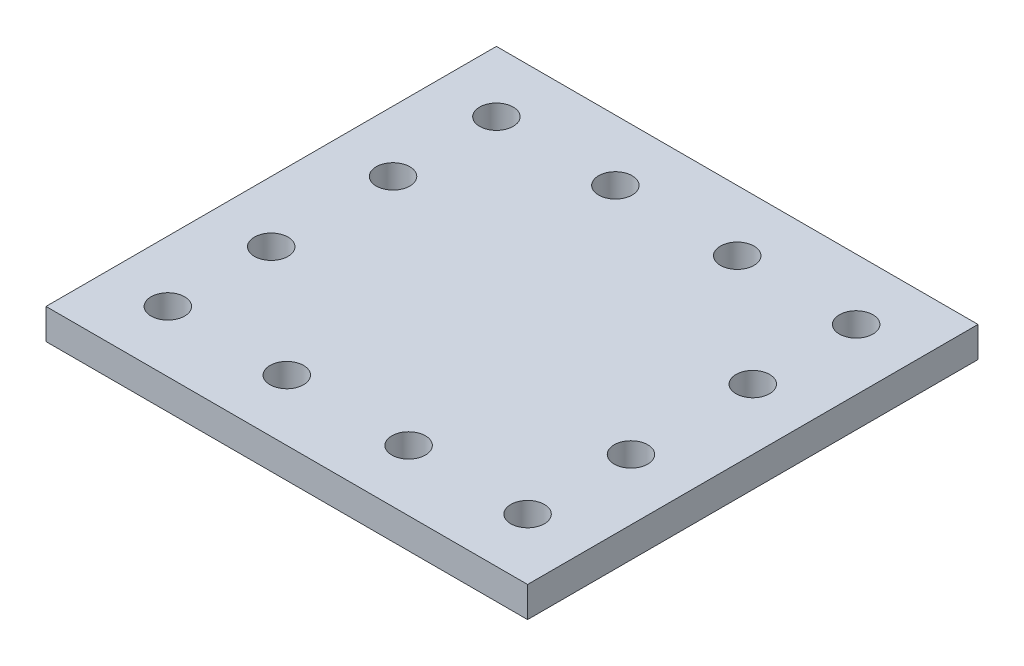
ISO-10303-21;
HEADER;
FILE_DESCRIPTION(('STEP AP214'),'2;1');
FILE_NAME('part.step','',(''),(''),'','','');
FILE_SCHEMA(('AUTOMOTIVE_DESIGN { 1 0 10303 214 1 1 1 1 }'));
ENDSEC;
DATA;
#1=APPLICATION_CONTEXT('core data for automotive mechanical design processes');
#2=APPLICATION_PROTOCOL_DEFINITION('international standard','automotive_design',2000,#1);
#3=PRODUCT_CONTEXT('',#1,'mechanical');
#4=PRODUCT('Part','Part','',(#3));
#5=PRODUCT_RELATED_PRODUCT_CATEGORY('part','',(#4));
#6=PRODUCT_DEFINITION_FORMATION('','',#4);
#7=PRODUCT_DEFINITION_CONTEXT('part definition',#1,'design');
#8=PRODUCT_DEFINITION('design','',#6,#7);
#9=PRODUCT_DEFINITION_SHAPE('','',#8);
#10=(LENGTH_UNIT() NAMED_UNIT(*) SI_UNIT(.MILLI.,.METRE.));
#11=(NAMED_UNIT(*) PLANE_ANGLE_UNIT() SI_UNIT($,.RADIAN.));
#12=(NAMED_UNIT(*) SI_UNIT($,.STERADIAN.) SOLID_ANGLE_UNIT());
#13=UNCERTAINTY_MEASURE_WITH_UNIT(LENGTH_MEASURE(1.E-05),#10,'distance_accuracy_value','');
#14=(GEOMETRIC_REPRESENTATION_CONTEXT(3) GLOBAL_UNCERTAINTY_ASSIGNED_CONTEXT((#13)) GLOBAL_UNIT_ASSIGNED_CONTEXT((#10,
#11,#12)) REPRESENTATION_CONTEXT('',''));
#15=CARTESIAN_POINT('',(0.,0.,0.));
#16=DIRECTION('',(0.,0.,1.));
#17=DIRECTION('',(1.,0.,0.));
#18=AXIS2_PLACEMENT_3D('',#15,#16,#17);
#19=CARTESIAN_POINT('',(0.,6.35,0.));
#20=DIRECTION('',(1.,0.,0.));
#21=DIRECTION('',(0.,0.,-1.));
#22=AXIS2_PLACEMENT_3D('',#19,#20,#21);
#23=PLANE('',#22);
#24=DIRECTION('',(0.,0.,1.));
#25=VECTOR('',#24,1.);
#26=CARTESIAN_POINT('',(0.,0.,0.));
#27=LINE('',#26,#25);
#28=CARTESIAN_POINT('',(0.,0.,-93.9));
#29=VERTEX_POINT('',#28);
#30=CARTESIAN_POINT('',(0.,0.,0.));
#31=VERTEX_POINT('',#30);
#32=EDGE_CURVE('E106',#29,#31,#27,.T.);
#33=ORIENTED_EDGE('',*,*,#32,.T.);
#34=DIRECTION('',(0.,-1.,0.));
#35=VECTOR('',#34,1.);
#36=CARTESIAN_POINT('',(0.,6.35,0.));
#37=LINE('',#36,#35);
#38=CARTESIAN_POINT('',(0.,6.35,0.));
#39=VERTEX_POINT('',#38);
#40=EDGE_CURVE('E11',#39,#31,#37,.T.);
#41=ORIENTED_EDGE('',*,*,#40,.F.);
#42=DIRECTION('',(0.,0.,1.));
#43=VECTOR('',#42,1.);
#44=CARTESIAN_POINT('',(0.,6.35,0.));
#45=LINE('',#44,#43);
#46=CARTESIAN_POINT('',(0.,6.35,-93.9));
#47=VERTEX_POINT('',#46);
#48=EDGE_CURVE('E90',#47,#39,#45,.T.);
#49=ORIENTED_EDGE('',*,*,#48,.F.);
#50=DIRECTION('',(0.,-1.,0.));
#51=VECTOR('',#50,1.);
#52=CARTESIAN_POINT('',(0.,6.35,-93.9));
#53=LINE('',#52,#51);
#54=EDGE_CURVE('E102',#47,#29,#53,.T.);
#55=ORIENTED_EDGE('',*,*,#54,.T.);
#56=EDGE_LOOP('',(#33,#41,#49,#55));
#57=FACE_BOUND('',#56,.T.);
#58=ADVANCED_FACE('F38',(#57),#23,.F.);
#59=CARTESIAN_POINT('',(0.,6.35,0.));
#60=DIRECTION('',(0.,0.,-1.));
#61=DIRECTION('',(-1.,0.,0.));
#62=AXIS2_PLACEMENT_3D('',#59,#60,#61);
#63=PLANE('',#62);
#64=DIRECTION('',(1.,0.,0.));
#65=VECTOR('',#64,1.);
#66=CARTESIAN_POINT('',(0.,0.,0.));
#67=LINE('',#66,#65);
#68=CARTESIAN_POINT('',(100.4,0.,0.));
#69=VERTEX_POINT('',#68);
#70=EDGE_CURVE('E95',#31,#69,#67,.T.);
#71=ORIENTED_EDGE('',*,*,#70,.T.);
#72=DIRECTION('',(0.,-1.,0.));
#73=VECTOR('',#72,1.);
#74=CARTESIAN_POINT('',(100.4,6.35,0.));
#75=LINE('',#74,#73);
#76=CARTESIAN_POINT('',(100.4,6.35,0.));
#77=VERTEX_POINT('',#76);
#78=EDGE_CURVE('E47',#77,#69,#75,.T.);
#79=ORIENTED_EDGE('',*,*,#78,.F.);
#80=DIRECTION('',(1.,0.,0.));
#81=VECTOR('',#80,1.);
#82=CARTESIAN_POINT('',(0.,6.35,0.));
#83=LINE('',#82,#81);
#84=EDGE_CURVE('E85',#39,#77,#83,.T.);
#85=ORIENTED_EDGE('',*,*,#84,.F.);
#86=ORIENTED_EDGE('',*,*,#40,.T.);
#87=EDGE_LOOP('',(#71,#79,#85,#86));
#88=FACE_BOUND('',#87,.T.);
#89=ADVANCED_FACE('F94',(#88),#63,.F.);
#90=CARTESIAN_POINT('',(100.4,6.35,0.));
#91=DIRECTION('',(-1.,0.,0.));
#92=DIRECTION('',(0.,0.,1.));
#93=AXIS2_PLACEMENT_3D('',#90,#91,#92);
#94=PLANE('',#93);
#95=DIRECTION('',(0.,0.,-1.));
#96=VECTOR('',#95,1.);
#97=CARTESIAN_POINT('',(100.4,0.,0.));
#98=LINE('',#97,#96);
#99=CARTESIAN_POINT('',(100.4,0.,-93.9));
#100=VERTEX_POINT('',#99);
#101=EDGE_CURVE('E72',#69,#100,#98,.T.);
#102=ORIENTED_EDGE('',*,*,#101,.T.);
#103=DIRECTION('',(0.,-1.,0.));
#104=VECTOR('',#103,1.);
#105=CARTESIAN_POINT('',(100.4,6.35,-93.9));
#106=LINE('',#105,#104);
#107=CARTESIAN_POINT('',(100.4,6.35,-93.9));
#108=VERTEX_POINT('',#107);
#109=EDGE_CURVE('E97',#108,#100,#106,.T.);
#110=ORIENTED_EDGE('',*,*,#109,.F.);
#111=DIRECTION('',(0.,0.,-1.));
#112=VECTOR('',#111,1.);
#113=CARTESIAN_POINT('',(100.4,6.35,0.));
#114=LINE('',#113,#112);
#115=EDGE_CURVE('E88',#77,#108,#114,.T.);
#116=ORIENTED_EDGE('',*,*,#115,.F.);
#117=ORIENTED_EDGE('',*,*,#78,.T.);
#118=EDGE_LOOP('',(#102,#110,#116,#117));
#119=FACE_BOUND('',#118,.T.);
#120=ADVANCED_FACE('F98',(#119),#94,.F.);
#121=CARTESIAN_POINT('',(0.,6.35,-93.9));
#122=DIRECTION('',(0.,0.,1.));
#123=DIRECTION('',(1.,0.,0.));
#124=AXIS2_PLACEMENT_3D('',#121,#122,#123);
#125=PLANE('',#124);
#126=DIRECTION('',(-1.,0.,0.));
#127=VECTOR('',#126,1.);
#128=CARTESIAN_POINT('',(0.,0.,-93.9));
#129=LINE('',#128,#127);
#130=EDGE_CURVE('E78',#100,#29,#129,.T.);
#131=ORIENTED_EDGE('',*,*,#130,.T.);
#132=ORIENTED_EDGE('',*,*,#54,.F.);
#133=DIRECTION('',(-1.,0.,0.));
#134=VECTOR('',#133,1.);
#135=CARTESIAN_POINT('',(0.,6.35,-93.9));
#136=LINE('',#135,#134);
#137=EDGE_CURVE('E55',#108,#47,#136,.T.);
#138=ORIENTED_EDGE('',*,*,#137,.F.);
#139=ORIENTED_EDGE('',*,*,#109,.T.);
#140=EDGE_LOOP('',(#131,#132,#138,#139));
#141=FACE_BOUND('',#140,.T.);
#142=ADVANCED_FACE('F120',(#141),#125,.F.);
#143=CARTESIAN_POINT('',(0.,6.35,0.));
#144=DIRECTION('',(0.,-1.,0.));
#145=DIRECTION('',(0.,0.,-1.));
#146=AXIS2_PLACEMENT_3D('',#143,#144,#145);
#147=PLANE('',#146);
#148=CARTESIAN_POINT('',(12.7,6.35,-34.25));
#149=DIRECTION('',(0.,1.,0.));
#150=DIRECTION('',(0.,0.,-1.));
#151=AXIS2_PLACEMENT_3D('',#148,#149,#150);
#152=CIRCLE('',#151,3.5);
#153=CARTESIAN_POINT('',(12.7,6.35,-37.75));
#154=VERTEX_POINT('',#153);
#155=EDGE_CURVE('E192',#154,#154,#152,.T.);
#156=ORIENTED_EDGE('',*,*,#155,.F.);
#157=EDGE_LOOP('',(#156));
#158=FACE_BOUND('',#157,.T.);
#159=CARTESIAN_POINT('',(87.7,6.35,-34.25));
#160=DIRECTION('',(0.,1.,0.));
#161=DIRECTION('',(0.,0.,1.));
#162=AXIS2_PLACEMENT_3D('',#159,#160,#161);
#163=CIRCLE('',#162,3.49999999999999);
#164=CARTESIAN_POINT('',(87.7,6.35,-30.75));
#165=VERTEX_POINT('',#164);
#166=EDGE_CURVE('E184',#165,#165,#163,.T.);
#167=ORIENTED_EDGE('',*,*,#166,.F.);
#168=EDGE_LOOP('',(#167));
#169=FACE_BOUND('',#168,.T.);
#170=CARTESIAN_POINT('',(87.7,6.35,-59.65));
#171=DIRECTION('',(0.,1.,0.));
#172=DIRECTION('',(0.,0.,-1.));
#173=AXIS2_PLACEMENT_3D('',#170,#171,#172);
#174=CIRCLE('',#173,3.49999999999999);
#175=CARTESIAN_POINT('',(87.7,6.35,-63.15));
#176=VERTEX_POINT('',#175);
#177=EDGE_CURVE('E176',#176,#176,#174,.T.);
#178=ORIENTED_EDGE('',*,*,#177,.F.);
#179=EDGE_LOOP('',(#178));
#180=FACE_BOUND('',#179,.T.);
#181=CARTESIAN_POINT('',(37.5,6.35,-81.2));
#182=DIRECTION('',(0.,1.,0.));
#183=DIRECTION('',(0.,0.,1.));
#184=AXIS2_PLACEMENT_3D('',#181,#182,#183);
#185=CIRCLE('',#184,3.5);
#186=CARTESIAN_POINT('',(37.5,6.35,-77.7));
#187=VERTEX_POINT('',#186);
#188=EDGE_CURVE('E167',#187,#187,#185,.T.);
#189=ORIENTED_EDGE('',*,*,#188,.F.);
#190=EDGE_LOOP('',(#189));
#191=FACE_BOUND('',#190,.T.);
#192=CARTESIAN_POINT('',(62.9,6.35,-81.2));
#193=DIRECTION('',(0.,1.,0.));
#194=DIRECTION('',(0.,0.,-1.));
#195=AXIS2_PLACEMENT_3D('',#192,#193,#194);
#196=CIRCLE('',#195,3.5);
#197=CARTESIAN_POINT('',(62.9,6.35,-84.7));
#198=VERTEX_POINT('',#197);
#199=EDGE_CURVE('E215',#198,#198,#196,.T.);
#200=ORIENTED_EDGE('',*,*,#199,.F.);
#201=EDGE_LOOP('',(#200));
#202=FACE_BOUND('',#201,.T.);
#203=CARTESIAN_POINT('',(62.9,6.35,-12.7));
#204=DIRECTION('',(0.,1.,0.));
#205=DIRECTION('',(0.,0.,1.));
#206=AXIS2_PLACEMENT_3D('',#203,#204,#205);
#207=CIRCLE('',#206,3.5);
#208=CARTESIAN_POINT('',(62.9,6.35,-9.2));
#209=VERTEX_POINT('',#208);
#210=EDGE_CURVE('E207',#209,#209,#207,.T.);
#211=ORIENTED_EDGE('',*,*,#210,.F.);
#212=EDGE_LOOP('',(#211));
#213=FACE_BOUND('',#212,.T.);
#214=CARTESIAN_POINT('',(37.5,6.35,-12.7));
#215=DIRECTION('',(0.,1.,0.));
#216=DIRECTION('',(0.,0.,-1.));
#217=AXIS2_PLACEMENT_3D('',#214,#215,#216);
#218=CIRCLE('',#217,3.5);
#219=CARTESIAN_POINT('',(37.5,6.35,-16.2));
#220=VERTEX_POINT('',#219);
#221=EDGE_CURVE('E199',#220,#220,#218,.T.);
#222=ORIENTED_EDGE('',*,*,#221,.F.);
#223=EDGE_LOOP('',(#222));
#224=FACE_BOUND('',#223,.T.);
#225=CARTESIAN_POINT('',(12.7,6.35,-59.65));
#226=DIRECTION('',(0.,1.,0.));
#227=DIRECTION('',(0.,0.,1.));
#228=AXIS2_PLACEMENT_3D('',#225,#226,#227);
#229=CIRCLE('',#228,3.5);
#230=CARTESIAN_POINT('',(12.7,6.35,-56.15));
#231=VERTEX_POINT('',#230);
#232=EDGE_CURVE('E159',#231,#231,#229,.T.);
#233=ORIENTED_EDGE('',*,*,#232,.F.);
#234=EDGE_LOOP('',(#233));
#235=FACE_BOUND('',#234,.T.);
#236=CARTESIAN_POINT('',(87.7,6.35,-81.2));
#237=DIRECTION('',(0.,1.,0.));
#238=DIRECTION('',(0.,0.,-1.));
#239=AXIS2_PLACEMENT_3D('',#236,#237,#238);
#240=CIRCLE('',#239,3.50000000000001);
#241=CARTESIAN_POINT('',(87.7,6.35,-84.7));
#242=VERTEX_POINT('',#241);
#243=EDGE_CURVE('E135',#242,#242,#240,.T.);
#244=ORIENTED_EDGE('',*,*,#243,.F.);
#245=EDGE_LOOP('',(#244));
#246=FACE_BOUND('',#245,.T.);
#247=CARTESIAN_POINT('',(87.7,6.35,-12.7));
#248=DIRECTION('',(0.,1.,0.));
#249=DIRECTION('',(0.,0.,1.));
#250=AXIS2_PLACEMENT_3D('',#247,#248,#249);
#251=CIRCLE('',#250,3.50000000000001);
#252=CARTESIAN_POINT('',(87.7,6.35,-9.19999999999999));
#253=VERTEX_POINT('',#252);
#254=EDGE_CURVE('E144',#253,#253,#251,.T.);
#255=ORIENTED_EDGE('',*,*,#254,.F.);
#256=EDGE_LOOP('',(#255));
#257=FACE_BOUND('',#256,.T.);
#258=CARTESIAN_POINT('',(12.7,6.35,-12.7));
#259=DIRECTION('',(0.,1.,0.));
#260=DIRECTION('',(0.,0.,-1.));
#261=AXIS2_PLACEMENT_3D('',#258,#259,#260);
#262=CIRCLE('',#261,3.5);
#263=CARTESIAN_POINT('',(12.7,6.35,-16.2));
#264=VERTEX_POINT('',#263);
#265=EDGE_CURVE('E152',#264,#264,#262,.T.);
#266=ORIENTED_EDGE('',*,*,#265,.F.);
#267=EDGE_LOOP('',(#266));
#268=FACE_BOUND('',#267,.T.);
#269=CARTESIAN_POINT('',(12.7,6.35,-81.2));
#270=DIRECTION('',(0.,1.,0.));
#271=DIRECTION('',(0.,0.,1.));
#272=AXIS2_PLACEMENT_3D('',#269,#270,#271);
#273=CIRCLE('',#272,3.5);
#274=CARTESIAN_POINT('',(12.7,6.35,-77.7));
#275=VERTEX_POINT('',#274);
#276=EDGE_CURVE('E127',#275,#275,#273,.T.);
#277=ORIENTED_EDGE('',*,*,#276,.F.);
#278=EDGE_LOOP('',(#277));
#279=FACE_BOUND('',#278,.T.);
#280=ORIENTED_EDGE('',*,*,#48,.T.);
#281=ORIENTED_EDGE('',*,*,#84,.T.);
#282=ORIENTED_EDGE('',*,*,#115,.T.);
#283=ORIENTED_EDGE('',*,*,#137,.T.);
#284=EDGE_LOOP('',(#280,#281,#282,#283));
#285=FACE_BOUND('',#284,.T.);
#286=ADVANCED_FACE('F86',(#158,#169,#180,#191,#202,#213,#224,#235,#246,#257,#268,#279,#285),
#147,.F.);
#287=CARTESIAN_POINT('',(0.,0.,0.));
#288=DIRECTION('',(0.,-1.,0.));
#289=DIRECTION('',(0.,0.,-1.));
#290=AXIS2_PLACEMENT_3D('',#287,#288,#289);
#291=PLANE('',#290);
#292=CARTESIAN_POINT('',(12.7,0.,-34.25));
#293=DIRECTION('',(0.,1.,0.));
#294=DIRECTION('',(0.,0.,-1.));
#295=AXIS2_PLACEMENT_3D('',#292,#293,#294);
#296=CIRCLE('',#295,3.5);
#297=CARTESIAN_POINT('',(12.7,0.,-37.75));
#298=VERTEX_POINT('',#297);
#299=EDGE_CURVE('E163',#298,#298,#296,.T.);
#300=ORIENTED_EDGE('',*,*,#299,.T.);
#301=EDGE_LOOP('',(#300));
#302=FACE_BOUND('',#301,.T.);
#303=CARTESIAN_POINT('',(87.7,0.,-34.25));
#304=DIRECTION('',(0.,1.,0.));
#305=DIRECTION('',(0.,0.,1.));
#306=AXIS2_PLACEMENT_3D('',#303,#304,#305);
#307=CIRCLE('',#306,3.49999999999999);
#308=CARTESIAN_POINT('',(87.7,0.,-30.75));
#309=VERTEX_POINT('',#308);
#310=EDGE_CURVE('E188',#309,#309,#307,.T.);
#311=ORIENTED_EDGE('',*,*,#310,.T.);
#312=EDGE_LOOP('',(#311));
#313=FACE_BOUND('',#312,.T.);
#314=CARTESIAN_POINT('',(87.7,0.,-59.65));
#315=DIRECTION('',(0.,1.,0.));
#316=DIRECTION('',(0.,0.,-1.));
#317=AXIS2_PLACEMENT_3D('',#314,#315,#316);
#318=CIRCLE('',#317,3.49999999999999);
#319=CARTESIAN_POINT('',(87.7,0.,-63.15));
#320=VERTEX_POINT('',#319);
#321=EDGE_CURVE('E180',#320,#320,#318,.T.);
#322=ORIENTED_EDGE('',*,*,#321,.T.);
#323=EDGE_LOOP('',(#322));
#324=FACE_BOUND('',#323,.T.);
#325=CARTESIAN_POINT('',(37.5,0.,-81.2));
#326=DIRECTION('',(0.,1.,0.));
#327=DIRECTION('',(0.,0.,1.));
#328=AXIS2_PLACEMENT_3D('',#325,#326,#327);
#329=CIRCLE('',#328,3.5);
#330=CARTESIAN_POINT('',(37.5,0.,-77.7));
#331=VERTEX_POINT('',#330);
#332=EDGE_CURVE('E171',#331,#331,#329,.T.);
#333=ORIENTED_EDGE('',*,*,#332,.T.);
#334=EDGE_LOOP('',(#333));
#335=FACE_BOUND('',#334,.T.);
#336=CARTESIAN_POINT('',(62.9,0.,-81.2));
#337=DIRECTION('',(0.,1.,0.));
#338=DIRECTION('',(0.,0.,-1.));
#339=AXIS2_PLACEMENT_3D('',#336,#337,#338);
#340=CIRCLE('',#339,3.5);
#341=CARTESIAN_POINT('',(62.9,0.,-84.7));
#342=VERTEX_POINT('',#341);
#343=EDGE_CURVE('E172',#342,#342,#340,.T.);
#344=ORIENTED_EDGE('',*,*,#343,.T.);
#345=EDGE_LOOP('',(#344));
#346=FACE_BOUND('',#345,.T.);
#347=CARTESIAN_POINT('',(62.9,0.,-12.7));
#348=DIRECTION('',(0.,1.,0.));
#349=DIRECTION('',(0.,0.,1.));
#350=AXIS2_PLACEMENT_3D('',#347,#348,#349);
#351=CIRCLE('',#350,3.5);
#352=CARTESIAN_POINT('',(62.9,0.,-9.2));
#353=VERTEX_POINT('',#352);
#354=EDGE_CURVE('E211',#353,#353,#351,.T.);
#355=ORIENTED_EDGE('',*,*,#354,.T.);
#356=EDGE_LOOP('',(#355));
#357=FACE_BOUND('',#356,.T.);
#358=CARTESIAN_POINT('',(37.5,0.,-12.7));
#359=DIRECTION('',(0.,1.,0.));
#360=DIRECTION('',(0.,0.,-1.));
#361=AXIS2_PLACEMENT_3D('',#358,#359,#360);
#362=CIRCLE('',#361,3.5);
#363=CARTESIAN_POINT('',(37.5,0.,-16.2));
#364=VERTEX_POINT('',#363);
#365=EDGE_CURVE('E203',#364,#364,#362,.T.);
#366=ORIENTED_EDGE('',*,*,#365,.T.);
#367=EDGE_LOOP('',(#366));
#368=FACE_BOUND('',#367,.T.);
#369=CARTESIAN_POINT('',(12.7,0.,-59.65));
#370=DIRECTION('',(0.,1.,0.));
#371=DIRECTION('',(0.,0.,1.));
#372=AXIS2_PLACEMENT_3D('',#369,#370,#371);
#373=CIRCLE('',#372,3.5);
#374=CARTESIAN_POINT('',(12.7,0.,-56.15));
#375=VERTEX_POINT('',#374);
#376=EDGE_CURVE('E140',#375,#375,#373,.T.);
#377=ORIENTED_EDGE('',*,*,#376,.T.);
#378=EDGE_LOOP('',(#377));
#379=FACE_BOUND('',#378,.T.);
#380=CARTESIAN_POINT('',(87.7,0.,-81.2));
#381=DIRECTION('',(0.,1.,0.));
#382=DIRECTION('',(0.,0.,-1.));
#383=AXIS2_PLACEMENT_3D('',#380,#381,#382);
#384=CIRCLE('',#383,3.50000000000001);
#385=CARTESIAN_POINT('',(87.7,0.,-84.7));
#386=VERTEX_POINT('',#385);
#387=EDGE_CURVE('E139',#386,#386,#384,.T.);
#388=ORIENTED_EDGE('',*,*,#387,.T.);
#389=EDGE_LOOP('',(#388));
#390=FACE_BOUND('',#389,.T.);
#391=CARTESIAN_POINT('',(87.7,0.,-12.7));
#392=DIRECTION('',(0.,1.,0.));
#393=DIRECTION('',(0.,0.,1.));
#394=AXIS2_PLACEMENT_3D('',#391,#392,#393);
#395=CIRCLE('',#394,3.50000000000001);
#396=CARTESIAN_POINT('',(87.7,0.,-9.19999999999999));
#397=VERTEX_POINT('',#396);
#398=EDGE_CURVE('E148',#397,#397,#395,.T.);
#399=ORIENTED_EDGE('',*,*,#398,.T.);
#400=EDGE_LOOP('',(#399));
#401=FACE_BOUND('',#400,.T.);
#402=CARTESIAN_POINT('',(12.7,0.,-12.7));
#403=DIRECTION('',(0.,1.,0.));
#404=DIRECTION('',(0.,0.,-1.));
#405=AXIS2_PLACEMENT_3D('',#402,#403,#404);
#406=CIRCLE('',#405,3.5);
#407=CARTESIAN_POINT('',(12.7,0.,-16.2));
#408=VERTEX_POINT('',#407);
#409=EDGE_CURVE('E131',#408,#408,#406,.T.);
#410=ORIENTED_EDGE('',*,*,#409,.T.);
#411=EDGE_LOOP('',(#410));
#412=FACE_BOUND('',#411,.T.);
#413=CARTESIAN_POINT('',(12.7,0.,-81.2));
#414=DIRECTION('',(0.,1.,0.));
#415=DIRECTION('',(0.,0.,1.));
#416=AXIS2_PLACEMENT_3D('',#413,#414,#415);
#417=CIRCLE('',#416,3.5);
#418=CARTESIAN_POINT('',(12.7,0.,-77.7));
#419=VERTEX_POINT('',#418);
#420=EDGE_CURVE('E110',#419,#419,#417,.T.);
#421=ORIENTED_EDGE('',*,*,#420,.T.);
#422=EDGE_LOOP('',(#421));
#423=FACE_BOUND('',#422,.T.);
#424=ORIENTED_EDGE('',*,*,#32,.F.);
#425=ORIENTED_EDGE('',*,*,#130,.F.);
#426=ORIENTED_EDGE('',*,*,#101,.F.);
#427=ORIENTED_EDGE('',*,*,#70,.F.);
#428=EDGE_LOOP('',(#424,#425,#426,#427));
#429=FACE_BOUND('',#428,.T.);
#430=ADVANCED_FACE('F123',(#302,#313,#324,#335,#346,#357,#368,#379,#390,#401,#412,#423,#429),
#291,.T.);
#431=CARTESIAN_POINT('',(12.7,0.,-81.2));
#432=DIRECTION('',(0.,1.,0.));
#433=DIRECTION('',(0.,0.,1.));
#434=AXIS2_PLACEMENT_3D('',#431,#432,#433);
#435=CYLINDRICAL_SURFACE('',#434,3.5);
#436=ORIENTED_EDGE('',*,*,#420,.F.);
#437=EDGE_LOOP('',(#436));
#438=FACE_BOUND('',#437,.T.);
#439=ORIENTED_EDGE('',*,*,#276,.T.);
#440=EDGE_LOOP('',(#439));
#441=FACE_BOUND('',#440,.T.);
#442=ADVANCED_FACE('F251',(#438,#441),#435,.F.);
#443=CARTESIAN_POINT('',(12.7,0.,-12.7));
#444=DIRECTION('',(0.,1.,0.));
#445=DIRECTION('',(0.,0.,1.));
#446=AXIS2_PLACEMENT_3D('',#443,#444,#445);
#447=CYLINDRICAL_SURFACE('',#446,3.5);
#448=ORIENTED_EDGE('',*,*,#409,.F.);
#449=EDGE_LOOP('',(#448));
#450=FACE_BOUND('',#449,.T.);
#451=ORIENTED_EDGE('',*,*,#265,.T.);
#452=EDGE_LOOP('',(#451));
#453=FACE_BOUND('',#452,.T.);
#454=ADVANCED_FACE('F253',(#450,#453),#447,.F.);
#455=CARTESIAN_POINT('',(87.7,0.,-12.7));
#456=DIRECTION('',(0.,1.,0.));
#457=DIRECTION('',(0.,0.,1.));
#458=AXIS2_PLACEMENT_3D('',#455,#456,#457);
#459=CYLINDRICAL_SURFACE('',#458,3.50000000000001);
#460=ORIENTED_EDGE('',*,*,#398,.F.);
#461=EDGE_LOOP('',(#460));
#462=FACE_BOUND('',#461,.T.);
#463=ORIENTED_EDGE('',*,*,#254,.T.);
#464=EDGE_LOOP('',(#463));
#465=FACE_BOUND('',#464,.T.);
#466=ADVANCED_FACE('F260',(#462,#465),#459,.F.);
#467=CARTESIAN_POINT('',(87.7,0.,-81.2));
#468=DIRECTION('',(0.,1.,0.));
#469=DIRECTION('',(0.,0.,1.));
#470=AXIS2_PLACEMENT_3D('',#467,#468,#469);
#471=CYLINDRICAL_SURFACE('',#470,3.50000000000001);
#472=ORIENTED_EDGE('',*,*,#387,.F.);
#473=EDGE_LOOP('',(#472));
#474=FACE_BOUND('',#473,.T.);
#475=ORIENTED_EDGE('',*,*,#243,.T.);
#476=EDGE_LOOP('',(#475));
#477=FACE_BOUND('',#476,.T.);
#478=ADVANCED_FACE('F304',(#474,#477),#471,.F.);
#479=CARTESIAN_POINT('',(12.7,0.,-59.65));
#480=DIRECTION('',(0.,1.,0.));
#481=DIRECTION('',(0.,0.,1.));
#482=AXIS2_PLACEMENT_3D('',#479,#480,#481);
#483=CYLINDRICAL_SURFACE('',#482,3.5);
#484=ORIENTED_EDGE('',*,*,#376,.F.);
#485=EDGE_LOOP('',(#484));
#486=FACE_BOUND('',#485,.T.);
#487=ORIENTED_EDGE('',*,*,#232,.T.);
#488=EDGE_LOOP('',(#487));
#489=FACE_BOUND('',#488,.T.);
#490=ADVANCED_FACE('F298',(#486,#489),#483,.F.);
#491=CARTESIAN_POINT('',(37.5,0.,-12.7));
#492=DIRECTION('',(0.,1.,0.));
#493=DIRECTION('',(0.,0.,1.));
#494=AXIS2_PLACEMENT_3D('',#491,#492,#493);
#495=CYLINDRICAL_SURFACE('',#494,3.5);
#496=ORIENTED_EDGE('',*,*,#365,.F.);
#497=EDGE_LOOP('',(#496));
#498=FACE_BOUND('',#497,.T.);
#499=ORIENTED_EDGE('',*,*,#221,.T.);
#500=EDGE_LOOP('',(#499));
#501=FACE_BOUND('',#500,.T.);
#502=ADVANCED_FACE('F303',(#498,#501),#495,.F.);
#503=CARTESIAN_POINT('',(62.9,0.,-12.7));
#504=DIRECTION('',(0.,1.,0.));
#505=DIRECTION('',(0.,0.,1.));
#506=AXIS2_PLACEMENT_3D('',#503,#504,#505);
#507=CYLINDRICAL_SURFACE('',#506,3.5);
#508=ORIENTED_EDGE('',*,*,#354,.F.);
#509=EDGE_LOOP('',(#508));
#510=FACE_BOUND('',#509,.T.);
#511=ORIENTED_EDGE('',*,*,#210,.T.);
#512=EDGE_LOOP('',(#511));
#513=FACE_BOUND('',#512,.T.);
#514=ADVANCED_FACE('F229',(#510,#513),#507,.F.);
#515=CARTESIAN_POINT('',(62.9,0.,-81.2));
#516=DIRECTION('',(0.,1.,0.));
#517=DIRECTION('',(0.,0.,1.));
#518=AXIS2_PLACEMENT_3D('',#515,#516,#517);
#519=CYLINDRICAL_SURFACE('',#518,3.5);
#520=ORIENTED_EDGE('',*,*,#343,.F.);
#521=EDGE_LOOP('',(#520));
#522=FACE_BOUND('',#521,.T.);
#523=ORIENTED_EDGE('',*,*,#199,.T.);
#524=EDGE_LOOP('',(#523));
#525=FACE_BOUND('',#524,.T.);
#526=ADVANCED_FACE('F225',(#522,#525),#519,.F.);
#527=CARTESIAN_POINT('',(37.5,0.,-81.2));
#528=DIRECTION('',(0.,1.,0.));
#529=DIRECTION('',(0.,0.,1.));
#530=AXIS2_PLACEMENT_3D('',#527,#528,#529);
#531=CYLINDRICAL_SURFACE('',#530,3.5);
#532=ORIENTED_EDGE('',*,*,#332,.F.);
#533=EDGE_LOOP('',(#532));
#534=FACE_BOUND('',#533,.T.);
#535=ORIENTED_EDGE('',*,*,#188,.T.);
#536=EDGE_LOOP('',(#535));
#537=FACE_BOUND('',#536,.T.);
#538=ADVANCED_FACE('F228',(#534,#537),#531,.F.);
#539=CARTESIAN_POINT('',(87.7,0.,-59.65));
#540=DIRECTION('',(0.,1.,0.));
#541=DIRECTION('',(0.,0.,1.));
#542=AXIS2_PLACEMENT_3D('',#539,#540,#541);
#543=CYLINDRICAL_SURFACE('',#542,3.49999999999999);
#544=ORIENTED_EDGE('',*,*,#321,.F.);
#545=EDGE_LOOP('',(#544));
#546=FACE_BOUND('',#545,.T.);
#547=ORIENTED_EDGE('',*,*,#177,.T.);
#548=EDGE_LOOP('',(#547));
#549=FACE_BOUND('',#548,.T.);
#550=ADVANCED_FACE('F340',(#546,#549),#543,.F.);
#551=CARTESIAN_POINT('',(87.7,0.,-34.25));
#552=DIRECTION('',(0.,1.,0.));
#553=DIRECTION('',(0.,0.,1.));
#554=AXIS2_PLACEMENT_3D('',#551,#552,#553);
#555=CYLINDRICAL_SURFACE('',#554,3.49999999999999);
#556=ORIENTED_EDGE('',*,*,#310,.F.);
#557=EDGE_LOOP('',(#556));
#558=FACE_BOUND('',#557,.T.);
#559=ORIENTED_EDGE('',*,*,#166,.T.);
#560=EDGE_LOOP('',(#559));
#561=FACE_BOUND('',#560,.T.);
#562=ADVANCED_FACE('F350',(#558,#561),#555,.F.);
#563=CARTESIAN_POINT('',(12.7,0.,-34.25));
#564=DIRECTION('',(0.,1.,0.));
#565=DIRECTION('',(0.,0.,1.));
#566=AXIS2_PLACEMENT_3D('',#563,#564,#565);
#567=CYLINDRICAL_SURFACE('',#566,3.5);
#568=ORIENTED_EDGE('',*,*,#299,.F.);
#569=EDGE_LOOP('',(#568));
#570=FACE_BOUND('',#569,.T.);
#571=ORIENTED_EDGE('',*,*,#155,.T.);
#572=EDGE_LOOP('',(#571));
#573=FACE_BOUND('',#572,.T.);
#574=ADVANCED_FACE('F360',(#570,#573),#567,.F.);
#575=CLOSED_SHELL('',(#58,#89,#120,#142,#286,#430,#442,#454,#466,#478,#490,#502,#514,#526,#538,
#550,#562,#574));
#576=MANIFOLD_SOLID_BREP('B2',#575);
#577=ADVANCED_BREP_SHAPE_REPRESENTATION('',(#18,#576),#14);
#578=SHAPE_DEFINITION_REPRESENTATION(#9,#577);
ENDSEC;
END-ISO-10303-21;
